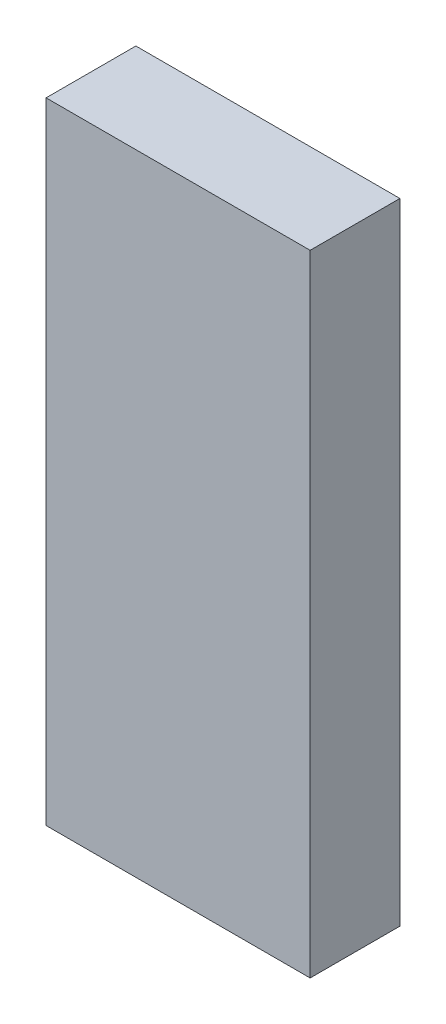
ISO-10303-21;
HEADER;
FILE_DESCRIPTION(('STEP AP214'),'2;1');
FILE_NAME('part.step','',(''),(''),'','','');
FILE_SCHEMA(('AUTOMOTIVE_DESIGN { 1 0 10303 214 1 1 1 1 }'));
ENDSEC;
DATA;
#1=APPLICATION_CONTEXT('core data for automotive mechanical design processes');
#2=APPLICATION_PROTOCOL_DEFINITION('international standard','automotive_design',2000,#1);
#3=PRODUCT_CONTEXT('',#1,'mechanical');
#4=PRODUCT('Part','Part','',(#3));
#5=PRODUCT_RELATED_PRODUCT_CATEGORY('part','',(#4));
#6=PRODUCT_DEFINITION_FORMATION('','',#4);
#7=PRODUCT_DEFINITION_CONTEXT('part definition',#1,'design');
#8=PRODUCT_DEFINITION('design','',#6,#7);
#9=PRODUCT_DEFINITION_SHAPE('','',#8);
#10=(LENGTH_UNIT() NAMED_UNIT(*) SI_UNIT(.MILLI.,.METRE.));
#11=(NAMED_UNIT(*) PLANE_ANGLE_UNIT() SI_UNIT($,.RADIAN.));
#12=(NAMED_UNIT(*) SI_UNIT($,.STERADIAN.) SOLID_ANGLE_UNIT());
#13=UNCERTAINTY_MEASURE_WITH_UNIT(LENGTH_MEASURE(1.E-05),#10,'distance_accuracy_value','');
#14=(GEOMETRIC_REPRESENTATION_CONTEXT(3) GLOBAL_UNCERTAINTY_ASSIGNED_CONTEXT((#13)) GLOBAL_UNIT_ASSIGNED_CONTEXT((#10,
#11,#12)) REPRESENTATION_CONTEXT('',''));
#15=CARTESIAN_POINT('',(0.,0.,0.));
#16=DIRECTION('',(0.,0.,1.));
#17=DIRECTION('',(1.,0.,0.));
#18=AXIS2_PLACEMENT_3D('',#15,#16,#17);
#19=CARTESIAN_POINT('',(-3.75000012,8.94999988,2.54999998));
#20=DIRECTION('',(0.,0.,-1.));
#21=DIRECTION('',(-1.,0.,0.));
#22=AXIS2_PLACEMENT_3D('',#19,#20,#21);
#23=PLANE('',#22);
#24=DIRECTION('',(1.,0.,0.));
#25=VECTOR('',#24,1.);
#26=CARTESIAN_POINT('',(-3.75000012,-8.94999988,2.54999998));
#27=LINE('',#26,#25);
#28=CARTESIAN_POINT('',(-3.75000012,-8.94999988,2.54999998));
#29=VERTEX_POINT('',#28);
#30=CARTESIAN_POINT('',(3.75000012,-8.94999988,2.54999998));
#31=VERTEX_POINT('',#30);
#32=EDGE_CURVE('E55',#29,#31,#27,.T.);
#33=ORIENTED_EDGE('',*,*,#32,.T.);
#34=DIRECTION('',(0.,1.,0.));
#35=VECTOR('',#34,1.);
#36=CARTESIAN_POINT('',(3.75000012,-8.94999988,2.54999998));
#37=LINE('',#36,#35);
#38=CARTESIAN_POINT('',(3.75000012,8.94999988,2.54999998));
#39=VERTEX_POINT('',#38);
#40=EDGE_CURVE('E57',#31,#39,#37,.T.);
#41=ORIENTED_EDGE('',*,*,#40,.T.);
#42=DIRECTION('',(1.,0.,0.));
#43=VECTOR('',#42,1.);
#44=CARTESIAN_POINT('',(3.75000012,8.94999988,2.54999998));
#45=LINE('',#44,#43);
#46=CARTESIAN_POINT('',(-3.75000012,8.94999988,2.54999998));
#47=VERTEX_POINT('',#46);
#48=EDGE_CURVE('E20',#39,#47,#45,.F.);
#49=ORIENTED_EDGE('',*,*,#48,.T.);
#50=DIRECTION('',(0.,1.,0.));
#51=VECTOR('',#50,1.);
#52=CARTESIAN_POINT('',(-3.75000012,8.94999988,2.54999998));
#53=LINE('',#52,#51);
#54=EDGE_CURVE('E80',#47,#29,#53,.F.);
#55=ORIENTED_EDGE('',*,*,#54,.T.);
#56=EDGE_LOOP('',(#33,#41,#49,#55));
#57=FACE_BOUND('',#56,.T.);
#58=ADVANCED_FACE('F17',(#57),#23,.F.);
#59=CARTESIAN_POINT('',(3.75000012,8.94999988,0.));
#60=DIRECTION('',(0.,-1.,0.));
#61=DIRECTION('',(0.,0.,-1.));
#62=AXIS2_PLACEMENT_3D('',#59,#60,#61);
#63=PLANE('',#62);
#64=DIRECTION('',(0.,0.,-1.));
#65=VECTOR('',#64,1.);
#66=CARTESIAN_POINT('',(-3.75000012,8.94999988,0.));
#67=LINE('',#66,#65);
#68=CARTESIAN_POINT('',(-3.75000012,8.94999988,0.));
#69=VERTEX_POINT('',#68);
#70=EDGE_CURVE('E68',#69,#47,#67,.F.);
#71=ORIENTED_EDGE('',*,*,#70,.T.);
#72=ORIENTED_EDGE('',*,*,#48,.F.);
#73=DIRECTION('',(0.,0.,1.));
#74=VECTOR('',#73,1.);
#75=CARTESIAN_POINT('',(3.75000012,8.94999988,0.));
#76=LINE('',#75,#74);
#77=CARTESIAN_POINT('',(3.75000012,8.94999988,0.));
#78=VERTEX_POINT('',#77);
#79=EDGE_CURVE('E63',#39,#78,#76,.F.);
#80=ORIENTED_EDGE('',*,*,#79,.T.);
#81=DIRECTION('',(-1.,0.,0.));
#82=VECTOR('',#81,1.);
#83=CARTESIAN_POINT('',(-3.75000012,8.94999988,0.));
#84=LINE('',#83,#82);
#85=EDGE_CURVE('E83',#69,#78,#84,.F.);
#86=ORIENTED_EDGE('',*,*,#85,.F.);
#87=EDGE_LOOP('',(#71,#72,#80,#86));
#88=FACE_BOUND('',#87,.T.);
#89=ADVANCED_FACE('F65',(#88),#63,.F.);
#90=CARTESIAN_POINT('',(3.75000012,-8.94999988,0.));
#91=DIRECTION('',(-1.,0.,0.));
#92=DIRECTION('',(0.,0.,1.));
#93=AXIS2_PLACEMENT_3D('',#90,#91,#92);
#94=PLANE('',#93);
#95=ORIENTED_EDGE('',*,*,#79,.F.);
#96=ORIENTED_EDGE('',*,*,#40,.F.);
#97=DIRECTION('',(0.,0.,1.));
#98=VECTOR('',#97,1.);
#99=CARTESIAN_POINT('',(3.75000012,-8.94999988,0.));
#100=LINE('',#99,#98);
#101=CARTESIAN_POINT('',(3.75000012,-8.94999988,0.));
#102=VERTEX_POINT('',#101);
#103=EDGE_CURVE('E75',#31,#102,#100,.F.);
#104=ORIENTED_EDGE('',*,*,#103,.T.);
#105=DIRECTION('',(0.,1.,0.));
#106=VECTOR('',#105,1.);
#107=CARTESIAN_POINT('',(3.75000012,8.94999988,0.));
#108=LINE('',#107,#106);
#109=EDGE_CURVE('E72',#78,#102,#108,.F.);
#110=ORIENTED_EDGE('',*,*,#109,.F.);
#111=EDGE_LOOP('',(#95,#96,#104,#110));
#112=FACE_BOUND('',#111,.T.);
#113=ADVANCED_FACE('F70',(#112),#94,.F.);
#114=CARTESIAN_POINT('',(-3.75000012,-8.94999988,0.));
#115=DIRECTION('',(0.,1.,0.));
#116=DIRECTION('',(0.,0.,1.));
#117=AXIS2_PLACEMENT_3D('',#114,#115,#116);
#118=PLANE('',#117);
#119=ORIENTED_EDGE('',*,*,#103,.F.);
#120=ORIENTED_EDGE('',*,*,#32,.F.);
#121=DIRECTION('',(0.,0.,-1.));
#122=VECTOR('',#121,1.);
#123=CARTESIAN_POINT('',(-3.75000012,-8.94999988,0.));
#124=LINE('',#123,#122);
#125=CARTESIAN_POINT('',(-3.75000012,-8.94999988,0.));
#126=VERTEX_POINT('',#125);
#127=EDGE_CURVE('E35',#29,#126,#124,.T.);
#128=ORIENTED_EDGE('',*,*,#127,.T.);
#129=DIRECTION('',(-1.,0.,0.));
#130=VECTOR('',#129,1.);
#131=CARTESIAN_POINT('',(-3.75000012,-8.94999988,0.));
#132=LINE('',#131,#130);
#133=EDGE_CURVE('E26',#102,#126,#132,.T.);
#134=ORIENTED_EDGE('',*,*,#133,.F.);
#135=EDGE_LOOP('',(#119,#120,#128,#134));
#136=FACE_BOUND('',#135,.T.);
#137=ADVANCED_FACE('F89',(#136),#118,.F.);
#138=CARTESIAN_POINT('',(-3.75000012,8.94999988,0.));
#139=DIRECTION('',(1.,0.,0.));
#140=DIRECTION('',(0.,0.,-1.));
#141=AXIS2_PLACEMENT_3D('',#138,#139,#140);
#142=PLANE('',#141);
#143=ORIENTED_EDGE('',*,*,#127,.F.);
#144=ORIENTED_EDGE('',*,*,#54,.F.);
#145=ORIENTED_EDGE('',*,*,#70,.F.);
#146=DIRECTION('',(0.,1.,0.));
#147=VECTOR('',#146,1.);
#148=CARTESIAN_POINT('',(-3.75000012,8.94999988,0.));
#149=LINE('',#148,#147);
#150=EDGE_CURVE('E11',#126,#69,#149,.T.);
#151=ORIENTED_EDGE('',*,*,#150,.F.);
#152=EDGE_LOOP('',(#143,#144,#145,#151));
#153=FACE_BOUND('',#152,.T.);
#154=ADVANCED_FACE('F91',(#153),#142,.F.);
#155=CARTESIAN_POINT('',(-3.75000012,8.94999988,0.));
#156=DIRECTION('',(0.,0.,-1.));
#157=DIRECTION('',(-1.,0.,0.));
#158=AXIS2_PLACEMENT_3D('',#155,#156,#157);
#159=PLANE('',#158);
#160=ORIENTED_EDGE('',*,*,#133,.T.);
#161=ORIENTED_EDGE('',*,*,#150,.T.);
#162=ORIENTED_EDGE('',*,*,#85,.T.);
#163=ORIENTED_EDGE('',*,*,#109,.T.);
#164=EDGE_LOOP('',(#160,#161,#162,#163));
#165=FACE_BOUND('',#164,.T.);
#166=ADVANCED_FACE('F88',(#165),#159,.T.);
#167=CLOSED_SHELL('',(#58,#89,#113,#137,#154,#166));
#168=MANIFOLD_SOLID_BREP('B1',#167);
#169=ADVANCED_BREP_SHAPE_REPRESENTATION('',(#18,#168),#14);
#170=SHAPE_DEFINITION_REPRESENTATION(#9,#169);
ENDSEC;
END-ISO-10303-21;
